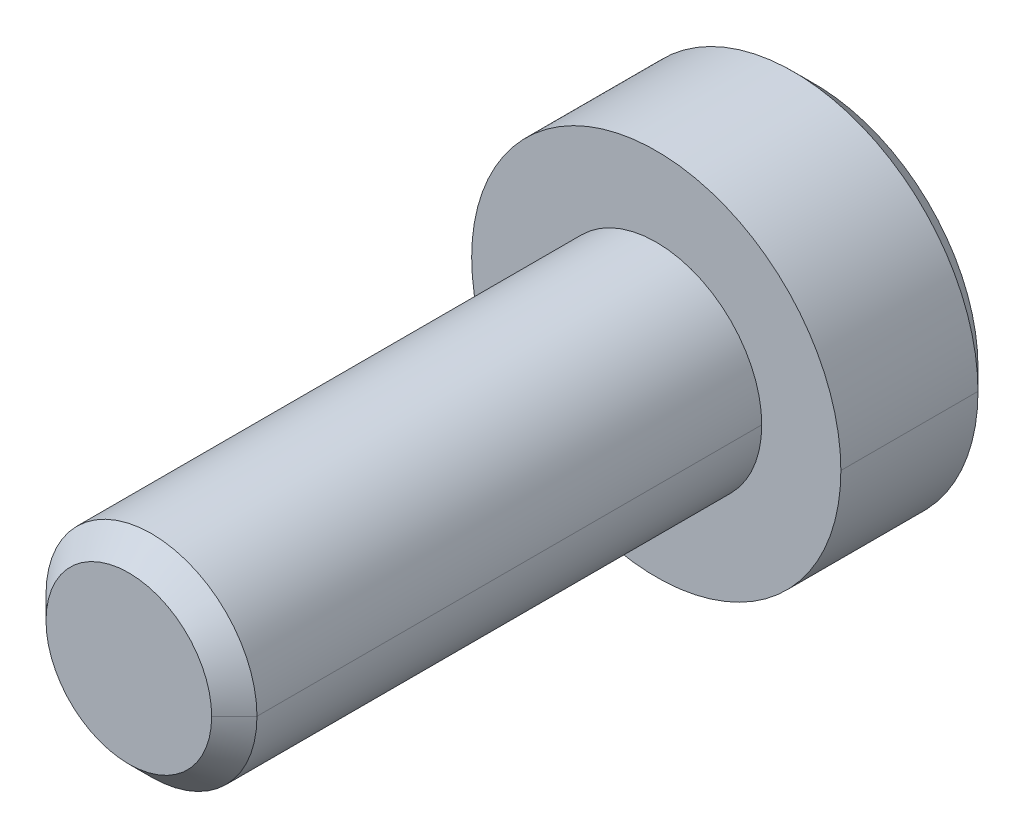
ISO-10303-21;
HEADER;
FILE_DESCRIPTION(('STEP AP214'),'2;1');
FILE_NAME('part.step','',(''),(''),'','','');
FILE_SCHEMA(('AUTOMOTIVE_DESIGN { 1 0 10303 214 1 1 1 1 }'));
ENDSEC;
DATA;
#1=APPLICATION_CONTEXT('core data for automotive mechanical design processes');
#2=APPLICATION_PROTOCOL_DEFINITION('international standard','automotive_design',2000,#1);
#3=PRODUCT_CONTEXT('',#1,'mechanical');
#4=PRODUCT('Part','Part','',(#3));
#5=PRODUCT_RELATED_PRODUCT_CATEGORY('part','',(#4));
#6=PRODUCT_DEFINITION_FORMATION('','',#4);
#7=PRODUCT_DEFINITION_CONTEXT('part definition',#1,'design');
#8=PRODUCT_DEFINITION('design','',#6,#7);
#9=PRODUCT_DEFINITION_SHAPE('','',#8);
#10=(LENGTH_UNIT() NAMED_UNIT(*) SI_UNIT(.MILLI.,.METRE.));
#11=(NAMED_UNIT(*) PLANE_ANGLE_UNIT() SI_UNIT($,.RADIAN.));
#12=(NAMED_UNIT(*) SI_UNIT($,.STERADIAN.) SOLID_ANGLE_UNIT());
#13=UNCERTAINTY_MEASURE_WITH_UNIT(LENGTH_MEASURE(1.E-05),#10,'distance_accuracy_value','');
#14=(GEOMETRIC_REPRESENTATION_CONTEXT(3) GLOBAL_UNCERTAINTY_ASSIGNED_CONTEXT((#13)) GLOBAL_UNIT_ASSIGNED_CONTEXT((#10,
#11,#12)) REPRESENTATION_CONTEXT('',''));
#15=CARTESIAN_POINT('',(0.,0.,0.));
#16=DIRECTION('',(0.,0.,1.));
#17=DIRECTION('',(1.,0.,0.));
#18=AXIS2_PLACEMENT_3D('',#15,#16,#17);
#19=CARTESIAN_POINT('',(0.,0.,2.));
#20=DIRECTION('',(0.,0.,-1.));
#21=DIRECTION('',(0.,-1.,0.));
#22=AXIS2_PLACEMENT_3D('',#19,#20,#21);
#23=PLANE('',#22);
#24=DIRECTION('',(0.866025403784439,0.5,0.));
#25=VECTOR('',#24,1.);
#26=CARTESIAN_POINT('',(-1.5,0.866025403784439,2.));
#27=LINE('',#26,#25);
#28=CARTESIAN_POINT('',(-1.5,0.866025403784439,2.));
#29=VERTEX_POINT('',#28);
#30=CARTESIAN_POINT('',(0.,1.73205080756888,2.));
#31=VERTEX_POINT('',#30);
#32=EDGE_CURVE('E209',#29,#31,#27,.T.);
#33=ORIENTED_EDGE('',*,*,#32,.T.);
#34=DIRECTION('',(0.866025403784439,-0.5,0.));
#35=VECTOR('',#34,1.);
#36=CARTESIAN_POINT('',(0.,1.73205080756888,2.));
#37=LINE('',#36,#35);
#38=CARTESIAN_POINT('',(1.5,0.866025403784439,2.));
#39=VERTEX_POINT('',#38);
#40=EDGE_CURVE('E9',#31,#39,#37,.T.);
#41=ORIENTED_EDGE('',*,*,#40,.T.);
#42=DIRECTION('',(0.,-1.,0.));
#43=VECTOR('',#42,1.);
#44=CARTESIAN_POINT('',(1.5,0.866025403784439,2.));
#45=LINE('',#44,#43);
#46=CARTESIAN_POINT('',(1.5,-0.866025403784439,2.));
#47=VERTEX_POINT('',#46);
#48=EDGE_CURVE('E42',#39,#47,#45,.T.);
#49=ORIENTED_EDGE('',*,*,#48,.T.);
#50=DIRECTION('',(-0.866025403784439,-0.5,0.));
#51=VECTOR('',#50,1.);
#52=CARTESIAN_POINT('',(1.5,-0.866025403784439,2.));
#53=LINE('',#52,#51);
#54=CARTESIAN_POINT('',(0.,-1.73205080756888,2.));
#55=VERTEX_POINT('',#54);
#56=EDGE_CURVE('E241',#47,#55,#53,.T.);
#57=ORIENTED_EDGE('',*,*,#56,.T.);
#58=DIRECTION('',(-0.866025403784439,0.5,0.));
#59=VECTOR('',#58,1.);
#60=CARTESIAN_POINT('',(0.,-1.73205080756888,2.));
#61=LINE('',#60,#59);
#62=CARTESIAN_POINT('',(-1.5,-0.86602540378444,2.));
#63=VERTEX_POINT('',#62);
#64=EDGE_CURVE('E264',#55,#63,#61,.T.);
#65=ORIENTED_EDGE('',*,*,#64,.T.);
#66=DIRECTION('',(0.,1.,0.));
#67=VECTOR('',#66,1.);
#68=CARTESIAN_POINT('',(-1.5,-0.86602540378444,2.));
#69=LINE('',#68,#67);
#70=EDGE_CURVE('E208',#63,#29,#69,.T.);
#71=ORIENTED_EDGE('',*,*,#70,.T.);
#72=EDGE_LOOP('',(#33,#41,#49,#57,#65,#71));
#73=FACE_BOUND('',#72,.T.);
#74=ADVANCED_FACE('F15',(#73),#23,.T.);
#75=CARTESIAN_POINT('',(0.,1.73205080756888,2.));
#76=DIRECTION('',(0.5,0.866025403784439,0.));
#77=DIRECTION('',(0.,0.,-1.));
#78=AXIS2_PLACEMENT_3D('',#75,#76,#77);
#79=PLANE('',#78);
#80=DIRECTION('',(0.866025403784439,-0.5,0.));
#81=VECTOR('',#80,1.);
#82=CARTESIAN_POINT('',(0.,1.73205080756888,0.));
#83=LINE('',#82,#81);
#84=CARTESIAN_POINT('',(0.,1.73205080756887,0.));
#85=VERTEX_POINT('',#84);
#86=CARTESIAN_POINT('',(1.5,0.866025403784439,0.));
#87=VERTEX_POINT('',#86);
#88=EDGE_CURVE('E224',#85,#87,#83,.T.);
#89=ORIENTED_EDGE('',*,*,#88,.T.);
#90=DIRECTION('',(0.,0.,-1.));
#91=VECTOR('',#90,1.);
#92=CARTESIAN_POINT('',(1.5,0.866025403784439,2.));
#93=LINE('',#92,#91);
#94=EDGE_CURVE('E23',#39,#87,#93,.T.);
#95=ORIENTED_EDGE('',*,*,#94,.F.);
#96=ORIENTED_EDGE('',*,*,#40,.F.);
#97=DIRECTION('',(0.,0.,-1.));
#98=VECTOR('',#97,1.);
#99=CARTESIAN_POINT('',(0.,1.73205080756888,2.));
#100=LINE('',#99,#98);
#101=EDGE_CURVE('E142',#31,#85,#100,.T.);
#102=ORIENTED_EDGE('',*,*,#101,.T.);
#103=EDGE_LOOP('',(#89,#95,#96,#102));
#104=FACE_BOUND('',#103,.T.);
#105=ADVANCED_FACE('F286',(#104),#79,.F.);
#106=CARTESIAN_POINT('',(1.5,0.866025403784439,2.));
#107=DIRECTION('',(1.,0.,0.));
#108=DIRECTION('',(0.,1.,0.));
#109=AXIS2_PLACEMENT_3D('',#106,#107,#108);
#110=PLANE('',#109);
#111=DIRECTION('',(0.,-1.,0.));
#112=VECTOR('',#111,1.);
#113=CARTESIAN_POINT('',(1.5,0.866025403784439,0.));
#114=LINE('',#113,#112);
#115=CARTESIAN_POINT('',(1.5,-0.866025403784439,0.));
#116=VERTEX_POINT('',#115);
#117=EDGE_CURVE('E249',#87,#116,#114,.T.);
#118=ORIENTED_EDGE('',*,*,#117,.T.);
#119=DIRECTION('',(0.,0.,-1.));
#120=VECTOR('',#119,1.);
#121=CARTESIAN_POINT('',(1.5,-0.866025403784439,2.));
#122=LINE('',#121,#120);
#123=EDGE_CURVE('E244',#47,#116,#122,.T.);
#124=ORIENTED_EDGE('',*,*,#123,.F.);
#125=ORIENTED_EDGE('',*,*,#48,.F.);
#126=ORIENTED_EDGE('',*,*,#94,.T.);
#127=EDGE_LOOP('',(#118,#124,#125,#126));
#128=FACE_BOUND('',#127,.T.);
#129=ADVANCED_FACE('F277',(#128),#110,.F.);
#130=CARTESIAN_POINT('',(1.5,-0.866025403784439,2.));
#131=DIRECTION('',(0.5,-0.866025403784439,0.));
#132=DIRECTION('',(0.,0.,-1.));
#133=AXIS2_PLACEMENT_3D('',#130,#131,#132);
#134=PLANE('',#133);
#135=DIRECTION('',(-0.866025403784439,-0.5,0.));
#136=VECTOR('',#135,1.);
#137=CARTESIAN_POINT('',(1.5,-0.866025403784439,0.));
#138=LINE('',#137,#136);
#139=CARTESIAN_POINT('',(0.,-1.73205080756888,0.));
#140=VERTEX_POINT('',#139);
#141=EDGE_CURVE('E240',#116,#140,#138,.T.);
#142=ORIENTED_EDGE('',*,*,#141,.T.);
#143=DIRECTION('',(0.,0.,-1.));
#144=VECTOR('',#143,1.);
#145=CARTESIAN_POINT('',(0.,-1.73205080756888,2.));
#146=LINE('',#145,#144);
#147=EDGE_CURVE('E245',#55,#140,#146,.T.);
#148=ORIENTED_EDGE('',*,*,#147,.F.);
#149=ORIENTED_EDGE('',*,*,#56,.F.);
#150=ORIENTED_EDGE('',*,*,#123,.T.);
#151=EDGE_LOOP('',(#142,#148,#149,#150));
#152=FACE_BOUND('',#151,.T.);
#153=ADVANCED_FACE('F303',(#152),#134,.F.);
#154=CARTESIAN_POINT('',(0.,-1.73205080756888,2.));
#155=DIRECTION('',(-0.5,-0.866025403784439,0.));
#156=DIRECTION('',(-0.866025403784439,0.5,0.));
#157=AXIS2_PLACEMENT_3D('',#154,#155,#156);
#158=PLANE('',#157);
#159=DIRECTION('',(-0.866025403784439,0.5,0.));
#160=VECTOR('',#159,1.);
#161=CARTESIAN_POINT('',(0.,-1.73205080756888,0.));
#162=LINE('',#161,#160);
#163=CARTESIAN_POINT('',(-1.5,-0.86602540378444,0.));
#164=VERTEX_POINT('',#163);
#165=EDGE_CURVE('E236',#140,#164,#162,.T.);
#166=ORIENTED_EDGE('',*,*,#165,.T.);
#167=DIRECTION('',(0.,0.,-1.));
#168=VECTOR('',#167,1.);
#169=CARTESIAN_POINT('',(-1.5,-0.86602540378444,2.));
#170=LINE('',#169,#168);
#171=EDGE_CURVE('E261',#63,#164,#170,.T.);
#172=ORIENTED_EDGE('',*,*,#171,.F.);
#173=ORIENTED_EDGE('',*,*,#64,.F.);
#174=ORIENTED_EDGE('',*,*,#147,.T.);
#175=EDGE_LOOP('',(#166,#172,#173,#174));
#176=FACE_BOUND('',#175,.T.);
#177=ADVANCED_FACE('F299',(#176),#158,.F.);
#178=CARTESIAN_POINT('',(-1.5,-0.86602540378444,2.));
#179=DIRECTION('',(-1.,0.,0.));
#180=DIRECTION('',(0.,1.,0.));
#181=AXIS2_PLACEMENT_3D('',#178,#179,#180);
#182=PLANE('',#181);
#183=DIRECTION('',(0.,1.,0.));
#184=VECTOR('',#183,1.);
#185=CARTESIAN_POINT('',(-1.5,-0.86602540378444,0.));
#186=LINE('',#185,#184);
#187=CARTESIAN_POINT('',(-1.5,0.866025403784439,0.));
#188=VERTEX_POINT('',#187);
#189=EDGE_CURVE('E232',#164,#188,#186,.T.);
#190=ORIENTED_EDGE('',*,*,#189,.T.);
#191=DIRECTION('',(0.,0.,-1.));
#192=VECTOR('',#191,1.);
#193=CARTESIAN_POINT('',(-1.5,0.866025403784439,2.));
#194=LINE('',#193,#192);
#195=EDGE_CURVE('E205',#29,#188,#194,.T.);
#196=ORIENTED_EDGE('',*,*,#195,.F.);
#197=ORIENTED_EDGE('',*,*,#70,.F.);
#198=ORIENTED_EDGE('',*,*,#171,.T.);
#199=EDGE_LOOP('',(#190,#196,#197,#198));
#200=FACE_BOUND('',#199,.T.);
#201=ADVANCED_FACE('F294',(#200),#182,.F.);
#202=CARTESIAN_POINT('',(-1.5,0.866025403784439,2.));
#203=DIRECTION('',(-0.5,0.866025403784439,0.));
#204=DIRECTION('',(0.,0.,1.));
#205=AXIS2_PLACEMENT_3D('',#202,#203,#204);
#206=PLANE('',#205);
#207=DIRECTION('',(0.866025403784439,0.5,0.));
#208=VECTOR('',#207,1.);
#209=CARTESIAN_POINT('',(-1.5,0.866025403784439,0.));
#210=LINE('',#209,#208);
#211=EDGE_CURVE('E228',#188,#85,#210,.T.);
#212=ORIENTED_EDGE('',*,*,#211,.T.);
#213=ORIENTED_EDGE('',*,*,#101,.F.);
#214=ORIENTED_EDGE('',*,*,#32,.F.);
#215=ORIENTED_EDGE('',*,*,#195,.T.);
#216=EDGE_LOOP('',(#212,#213,#214,#215));
#217=FACE_BOUND('',#216,.T.);
#218=ADVANCED_FACE('F290',(#217),#206,.F.);
#219=CARTESIAN_POINT('',(0.,0.,13.));
#220=DIRECTION('',(0.,0.,-1.));
#221=DIRECTION('',(-1.,0.,0.));
#222=AXIS2_PLACEMENT_3D('',#219,#220,#221);
#223=CONICAL_SURFACE('',#222,1.5705,0.785398163397448);
#224=DIRECTION('',(0.707106781186548,0.,-0.707106781186548));
#225=VECTOR('',#224,1.);
#226=CARTESIAN_POINT('',(1.5705,0.,13.));
#227=LINE('',#226,#225);
#228=CARTESIAN_POINT('',(1.5705,0.,13.));
#229=VERTEX_POINT('',#228);
#230=CARTESIAN_POINT('',(2.,0.,12.5705));
#231=VERTEX_POINT('',#230);
#232=EDGE_CURVE('E146',#229,#231,#227,.T.);
#233=ORIENTED_EDGE('',*,*,#232,.F.);
#234=CARTESIAN_POINT('',(0.,0.,13.));
#235=DIRECTION('',(0.,0.,1.));
#236=DIRECTION('',(1.,0.,0.));
#237=AXIS2_PLACEMENT_3D('',#234,#235,#236);
#238=CIRCLE('',#237,1.5705);
#239=CARTESIAN_POINT('',(-1.5705,0.,13.));
#240=VERTEX_POINT('',#239);
#241=EDGE_CURVE('E133',#240,#229,#238,.T.);
#242=ORIENTED_EDGE('',*,*,#241,.F.);
#243=DIRECTION('',(-0.707106781186548,0.,-0.707106781186548));
#244=VECTOR('',#243,1.);
#245=CARTESIAN_POINT('',(-1.5705,0.,13.));
#246=LINE('',#245,#244);
#247=CARTESIAN_POINT('',(-2.,0.,12.5705));
#248=VERTEX_POINT('',#247);
#249=EDGE_CURVE('E155',#240,#248,#246,.T.);
#250=ORIENTED_EDGE('',*,*,#249,.T.);
#251=CARTESIAN_POINT('',(0.,0.,12.5705));
#252=DIRECTION('',(0.,0.,-1.));
#253=DIRECTION('',(1.,0.,0.));
#254=AXIS2_PLACEMENT_3D('',#251,#252,#253);
#255=CIRCLE('',#254,2.);
#256=EDGE_CURVE('E143',#231,#248,#255,.T.);
#257=ORIENTED_EDGE('',*,*,#256,.F.);
#258=EDGE_LOOP('',(#233,#242,#250,#257));
#259=FACE_BOUND('',#258,.T.);
#260=ADVANCED_FACE('F147',(#259),#223,.T.);
#261=CARTESIAN_POINT('',(0.,0.,0.4));
#262=DIRECTION('',(0.,0.,1.));
#263=DIRECTION('',(1.,0.,0.));
#264=AXIS2_PLACEMENT_3D('',#261,#262,#263);
#265=CONICAL_SURFACE('',#264,3.5,0.78539816339745);
#266=DIRECTION('',(-0.707106781186549,0.,0.707106781186546));
#267=VECTOR('',#266,1.);
#268=CARTESIAN_POINT('',(-3.5,0.,0.4));
#269=LINE('',#268,#267);
#270=CARTESIAN_POINT('',(-3.1,0.,0.));
#271=VERTEX_POINT('',#270);
#272=CARTESIAN_POINT('',(-3.5,0.,0.4));
#273=VERTEX_POINT('',#272);
#274=EDGE_CURVE('E182',#271,#273,#269,.T.);
#275=ORIENTED_EDGE('',*,*,#274,.F.);
#276=CARTESIAN_POINT('',(0.,0.,0.));
#277=DIRECTION('',(0.,0.,-1.));
#278=DIRECTION('',(1.,0.,0.));
#279=AXIS2_PLACEMENT_3D('',#276,#277,#278);
#280=CIRCLE('',#279,3.1);
#281=CARTESIAN_POINT('',(3.1,0.,0.));
#282=VERTEX_POINT('',#281);
#283=EDGE_CURVE('E221',#282,#271,#280,.T.);
#284=ORIENTED_EDGE('',*,*,#283,.F.);
#285=DIRECTION('',(0.707106781186549,0.,0.707106781186546));
#286=VECTOR('',#285,1.);
#287=CARTESIAN_POINT('',(3.5,0.,0.4));
#288=LINE('',#287,#286);
#289=CARTESIAN_POINT('',(3.5,0.,0.4));
#290=VERTEX_POINT('',#289);
#291=EDGE_CURVE('E162',#282,#290,#288,.T.);
#292=ORIENTED_EDGE('',*,*,#291,.T.);
#293=CARTESIAN_POINT('',(0.,0.,0.4));
#294=DIRECTION('',(0.,0.,1.));
#295=DIRECTION('',(1.,0.,0.));
#296=AXIS2_PLACEMENT_3D('',#293,#294,#295);
#297=CIRCLE('',#296,3.5);
#298=EDGE_CURVE('E201',#273,#290,#297,.T.);
#299=ORIENTED_EDGE('',*,*,#298,.F.);
#300=EDGE_LOOP('',(#275,#284,#292,#299));
#301=FACE_BOUND('',#300,.T.);
#302=ADVANCED_FACE('F337',(#301),#265,.T.);
#303=CARTESIAN_POINT('',(0.,0.,13.));
#304=DIRECTION('',(0.,0.,1.));
#305=DIRECTION('',(1.,0.,0.));
#306=AXIS2_PLACEMENT_3D('',#303,#304,#305);
#307=PLANE('',#306);
#308=ORIENTED_EDGE('',*,*,#241,.T.);
#309=CARTESIAN_POINT('',(0.,0.,13.));
#310=DIRECTION('',(0.,0.,1.));
#311=DIRECTION('',(1.,0.,0.));
#312=AXIS2_PLACEMENT_3D('',#309,#310,#311);
#313=CIRCLE('',#312,1.5705);
#314=EDGE_CURVE('E137',#229,#240,#313,.T.);
#315=ORIENTED_EDGE('',*,*,#314,.T.);
#316=EDGE_LOOP('',(#308,#315));
#317=FACE_BOUND('',#316,.T.);
#318=ADVANCED_FACE('F135',(#317),#307,.T.);
#319=CARTESIAN_POINT('',(0.,0.,13.));
#320=DIRECTION('',(0.,0.,-1.));
#321=DIRECTION('',(-1.,0.,0.));
#322=AXIS2_PLACEMENT_3D('',#319,#320,#321);
#323=CYLINDRICAL_SURFACE('',#322,2.);
#324=DIRECTION('',(0.,0.,-1.));
#325=VECTOR('',#324,1.);
#326=CARTESIAN_POINT('',(2.,0.,13.));
#327=LINE('',#326,#325);
#328=CARTESIAN_POINT('',(2.,0.,3.));
#329=VERTEX_POINT('',#328);
#330=EDGE_CURVE('E165',#231,#329,#327,.T.);
#331=ORIENTED_EDGE('',*,*,#330,.F.);
#332=ORIENTED_EDGE('',*,*,#256,.T.);
#333=DIRECTION('',(0.,0.,-1.));
#334=VECTOR('',#333,1.);
#335=CARTESIAN_POINT('',(-2.,0.,13.));
#336=LINE('',#335,#334);
#337=CARTESIAN_POINT('',(-2.,0.,3.));
#338=VERTEX_POINT('',#337);
#339=EDGE_CURVE('E178',#248,#338,#336,.T.);
#340=ORIENTED_EDGE('',*,*,#339,.T.);
#341=CARTESIAN_POINT('',(0.,0.,3.));
#342=DIRECTION('',(0.,0.,1.));
#343=DIRECTION('',(1.,0.,0.));
#344=AXIS2_PLACEMENT_3D('',#341,#342,#343);
#345=CIRCLE('',#344,2.);
#346=EDGE_CURVE('E215',#338,#329,#345,.T.);
#347=ORIENTED_EDGE('',*,*,#346,.T.);
#348=EDGE_LOOP('',(#331,#332,#340,#347));
#349=FACE_BOUND('',#348,.T.);
#350=ADVANCED_FACE('F331',(#349),#323,.T.);
#351=CARTESIAN_POINT('',(0.,0.,0.));
#352=DIRECTION('',(0.,0.,1.));
#353=DIRECTION('',(1.,0.,0.));
#354=AXIS2_PLACEMENT_3D('',#351,#352,#353);
#355=PLANE('',#354);
#356=ORIENTED_EDGE('',*,*,#88,.F.);
#357=ORIENTED_EDGE('',*,*,#211,.F.);
#358=ORIENTED_EDGE('',*,*,#189,.F.);
#359=ORIENTED_EDGE('',*,*,#165,.F.);
#360=ORIENTED_EDGE('',*,*,#141,.F.);
#361=ORIENTED_EDGE('',*,*,#117,.F.);
#362=EDGE_LOOP('',(#356,#357,#358,#359,#360,#361));
#363=FACE_BOUND('',#362,.T.);
#364=ORIENTED_EDGE('',*,*,#283,.T.);
#365=CARTESIAN_POINT('',(0.,0.,0.));
#366=DIRECTION('',(0.,0.,-1.));
#367=DIRECTION('',(1.,0.,0.));
#368=AXIS2_PLACEMENT_3D('',#365,#366,#367);
#369=CIRCLE('',#368,3.1);
#370=EDGE_CURVE('E173',#271,#282,#369,.T.);
#371=ORIENTED_EDGE('',*,*,#370,.T.);
#372=EDGE_LOOP('',(#364,#371));
#373=FACE_BOUND('',#372,.T.);
#374=ADVANCED_FACE('F282',(#363,#373),#355,.F.);
#375=CARTESIAN_POINT('',(0.,0.,3.));
#376=DIRECTION('',(0.,0.,1.));
#377=DIRECTION('',(1.,0.,0.));
#378=AXIS2_PLACEMENT_3D('',#375,#376,#377);
#379=PLANE('',#378);
#380=ORIENTED_EDGE('',*,*,#346,.F.);
#381=CARTESIAN_POINT('',(0.,0.,3.));
#382=DIRECTION('',(0.,0.,1.));
#383=DIRECTION('',(1.,0.,0.));
#384=AXIS2_PLACEMENT_3D('',#381,#382,#383);
#385=CIRCLE('',#384,2.);
#386=EDGE_CURVE('E174',#329,#338,#385,.T.);
#387=ORIENTED_EDGE('',*,*,#386,.F.);
#388=EDGE_LOOP('',(#380,#387));
#389=FACE_BOUND('',#388,.T.);
#390=CARTESIAN_POINT('',(0.,0.,3.));
#391=DIRECTION('',(0.,0.,1.));
#392=DIRECTION('',(1.,0.,0.));
#393=AXIS2_PLACEMENT_3D('',#390,#391,#392);
#394=CIRCLE('',#393,3.5);
#395=CARTESIAN_POINT('',(-3.5,0.,3.));
#396=VERTEX_POINT('',#395);
#397=CARTESIAN_POINT('',(3.5,0.,3.));
#398=VERTEX_POINT('',#397);
#399=EDGE_CURVE('E198',#396,#398,#394,.T.);
#400=ORIENTED_EDGE('',*,*,#399,.T.);
#401=CARTESIAN_POINT('',(0.,0.,3.));
#402=DIRECTION('',(0.,0.,1.));
#403=DIRECTION('',(1.,0.,0.));
#404=AXIS2_PLACEMENT_3D('',#401,#402,#403);
#405=CIRCLE('',#404,3.5);
#406=EDGE_CURVE('E194',#398,#396,#405,.T.);
#407=ORIENTED_EDGE('',*,*,#406,.T.);
#408=EDGE_LOOP('',(#400,#407));
#409=FACE_BOUND('',#408,.T.);
#410=ADVANCED_FACE('F325',(#389,#409),#379,.T.);
#411=CARTESIAN_POINT('',(0.,0.,3.));
#412=DIRECTION('',(0.,0.,-1.));
#413=DIRECTION('',(-1.,0.,0.));
#414=AXIS2_PLACEMENT_3D('',#411,#412,#413);
#415=CYLINDRICAL_SURFACE('',#414,3.5);
#416=DIRECTION('',(0.,0.,-1.));
#417=VECTOR('',#416,1.);
#418=CARTESIAN_POINT('',(3.5,0.,3.));
#419=LINE('',#418,#417);
#420=EDGE_CURVE('E189',#398,#290,#419,.T.);
#421=ORIENTED_EDGE('',*,*,#420,.F.);
#422=ORIENTED_EDGE('',*,*,#399,.F.);
#423=DIRECTION('',(0.,0.,-1.));
#424=VECTOR('',#423,1.);
#425=CARTESIAN_POINT('',(-3.5,0.,3.));
#426=LINE('',#425,#424);
#427=EDGE_CURVE('E193',#396,#273,#426,.T.);
#428=ORIENTED_EDGE('',*,*,#427,.T.);
#429=ORIENTED_EDGE('',*,*,#298,.T.);
#430=EDGE_LOOP('',(#421,#422,#428,#429));
#431=FACE_BOUND('',#430,.T.);
#432=ADVANCED_FACE('F321',(#431),#415,.T.);
#433=CARTESIAN_POINT('',(0.,0.,3.));
#434=DIRECTION('',(0.,0.,-1.));
#435=DIRECTION('',(-1.,0.,0.));
#436=AXIS2_PLACEMENT_3D('',#433,#434,#435);
#437=CYLINDRICAL_SURFACE('',#436,3.5);
#438=ORIENTED_EDGE('',*,*,#406,.F.);
#439=ORIENTED_EDGE('',*,*,#420,.T.);
#440=CARTESIAN_POINT('',(0.,0.,0.4));
#441=DIRECTION('',(0.,0.,1.));
#442=DIRECTION('',(1.,0.,0.));
#443=AXIS2_PLACEMENT_3D('',#440,#441,#442);
#444=CIRCLE('',#443,3.5);
#445=EDGE_CURVE('E166',#290,#273,#444,.T.);
#446=ORIENTED_EDGE('',*,*,#445,.T.);
#447=ORIENTED_EDGE('',*,*,#427,.F.);
#448=EDGE_LOOP('',(#438,#439,#446,#447));
#449=FACE_BOUND('',#448,.T.);
#450=ADVANCED_FACE('F318',(#449),#437,.T.);
#451=CARTESIAN_POINT('',(0.,0.,13.));
#452=DIRECTION('',(0.,0.,-1.));
#453=DIRECTION('',(-1.,0.,0.));
#454=AXIS2_PLACEMENT_3D('',#451,#452,#453);
#455=CYLINDRICAL_SURFACE('',#454,2.);
#456=CARTESIAN_POINT('',(0.,0.,12.5705));
#457=DIRECTION('',(0.,0.,-1.));
#458=DIRECTION('',(1.,0.,0.));
#459=AXIS2_PLACEMENT_3D('',#456,#457,#458);
#460=CIRCLE('',#459,2.);
#461=EDGE_CURVE('E152',#248,#231,#460,.T.);
#462=ORIENTED_EDGE('',*,*,#461,.T.);
#463=ORIENTED_EDGE('',*,*,#330,.T.);
#464=ORIENTED_EDGE('',*,*,#386,.T.);
#465=ORIENTED_EDGE('',*,*,#339,.F.);
#466=EDGE_LOOP('',(#462,#463,#464,#465));
#467=FACE_BOUND('',#466,.T.);
#468=ADVANCED_FACE('F315',(#467),#455,.T.);
#469=CARTESIAN_POINT('',(0.,0.,0.4));
#470=DIRECTION('',(0.,0.,1.));
#471=DIRECTION('',(1.,0.,0.));
#472=AXIS2_PLACEMENT_3D('',#469,#470,#471);
#473=CONICAL_SURFACE('',#472,3.5,0.78539816339745);
#474=ORIENTED_EDGE('',*,*,#370,.F.);
#475=ORIENTED_EDGE('',*,*,#274,.T.);
#476=ORIENTED_EDGE('',*,*,#445,.F.);
#477=ORIENTED_EDGE('',*,*,#291,.F.);
#478=EDGE_LOOP('',(#474,#475,#476,#477));
#479=FACE_BOUND('',#478,.T.);
#480=ADVANCED_FACE('F353',(#479),#473,.T.);
#481=CARTESIAN_POINT('',(0.,0.,13.));
#482=DIRECTION('',(0.,0.,-1.));
#483=DIRECTION('',(-1.,0.,0.));
#484=AXIS2_PLACEMENT_3D('',#481,#482,#483);
#485=CONICAL_SURFACE('',#484,1.5705,0.785398163397448);
#486=ORIENTED_EDGE('',*,*,#314,.F.);
#487=ORIENTED_EDGE('',*,*,#232,.T.);
#488=ORIENTED_EDGE('',*,*,#461,.F.);
#489=ORIENTED_EDGE('',*,*,#249,.F.);
#490=EDGE_LOOP('',(#486,#487,#488,#489));
#491=FACE_BOUND('',#490,.T.);
#492=ADVANCED_FACE('F154',(#491),#485,.T.);
#493=CLOSED_SHELL('',(#74,#105,#129,#153,#177,#201,#218,#260,#302,#318,#350,#374,#410,#432,#450,
#468,#480,#492));
#494=MANIFOLD_SOLID_BREP('B1',#493);
#495=ADVANCED_BREP_SHAPE_REPRESENTATION('',(#18,#494),#14);
#496=SHAPE_DEFINITION_REPRESENTATION(#9,#495);
ENDSEC;
END-ISO-10303-21;
